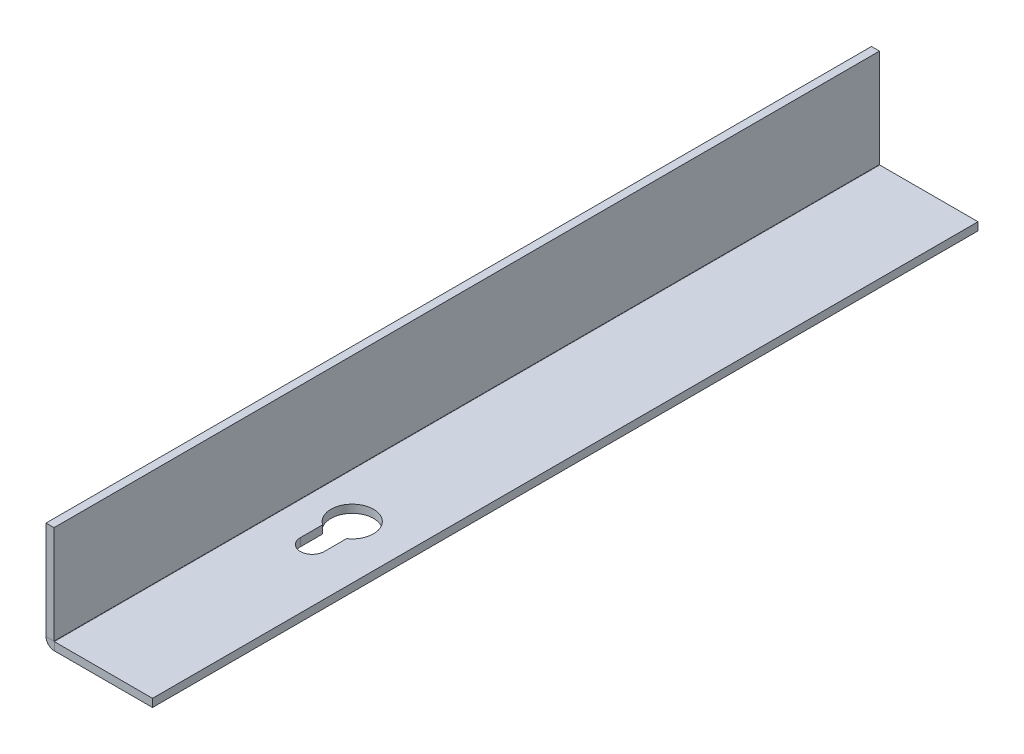
ISO-10303-21;
HEADER;
FILE_DESCRIPTION(('STEP AP214'),'2;1');
FILE_NAME('part.step','',(''),(''),'','','');
FILE_SCHEMA(('AUTOMOTIVE_DESIGN { 1 0 10303 214 1 1 1 1 }'));
ENDSEC;
DATA;
#1=APPLICATION_CONTEXT('core data for automotive mechanical design processes');
#2=APPLICATION_PROTOCOL_DEFINITION('international standard','automotive_design',2000,#1);
#3=PRODUCT_CONTEXT('',#1,'mechanical');
#4=PRODUCT('Part','Part','',(#3));
#5=PRODUCT_RELATED_PRODUCT_CATEGORY('part','',(#4));
#6=PRODUCT_DEFINITION_FORMATION('','',#4);
#7=PRODUCT_DEFINITION_CONTEXT('part definition',#1,'design');
#8=PRODUCT_DEFINITION('design','',#6,#7);
#9=PRODUCT_DEFINITION_SHAPE('','',#8);
#10=(LENGTH_UNIT() NAMED_UNIT(*) SI_UNIT(.MILLI.,.METRE.));
#11=(NAMED_UNIT(*) PLANE_ANGLE_UNIT() SI_UNIT($,.RADIAN.));
#12=(NAMED_UNIT(*) SI_UNIT($,.STERADIAN.) SOLID_ANGLE_UNIT());
#13=UNCERTAINTY_MEASURE_WITH_UNIT(LENGTH_MEASURE(1.E-05),#10,'distance_accuracy_value','');
#14=(GEOMETRIC_REPRESENTATION_CONTEXT(3) GLOBAL_UNCERTAINTY_ASSIGNED_CONTEXT((#13)) GLOBAL_UNIT_ASSIGNED_CONTEXT((#10,
#11,#12)) REPRESENTATION_CONTEXT('',''));
#15=CARTESIAN_POINT('',(0.,0.,0.));
#16=DIRECTION('',(0.,0.,1.));
#17=DIRECTION('',(1.,0.,0.));
#18=AXIS2_PLACEMENT_3D('',#15,#16,#17);
#19=CARTESIAN_POINT('',(-259.500000000001,-155.,-100.));
#20=DIRECTION('',(-1.,0.,0.));
#21=DIRECTION('',(0.,0.,1.));
#22=AXIS2_PLACEMENT_3D('',#19,#20,#21);
#23=PLANE('',#22);
#24=DIRECTION('',(0.,0.,1.));
#25=VECTOR('',#24,1.);
#26=CARTESIAN_POINT('',(-259.500000000001,-175.,20.));
#27=LINE('',#26,#25);
#28=CARTESIAN_POINT('',(-259.500000000001,-175.,-100.));
#29=VERTEX_POINT('',#28);
#30=CARTESIAN_POINT('',(-259.500000000001,-175.,-108.385621722338));
#31=VERTEX_POINT('',#30);
#32=EDGE_CURVE('E292',#29,#31,#27,.F.);
#33=ORIENTED_EDGE('',*,*,#32,.T.);
#34=DIRECTION('',(0.,1.,0.));
#35=VECTOR('',#34,1.);
#36=CARTESIAN_POINT('',(-259.500000000001,-155.,-108.385621722338));
#37=LINE('',#36,#35);
#38=CARTESIAN_POINT('',(-259.500000000001,-172.,-108.385621722338));
#39=VERTEX_POINT('',#38);
#40=EDGE_CURVE('E255',#39,#31,#37,.F.);
#41=ORIENTED_EDGE('',*,*,#40,.F.);
#42=DIRECTION('',(0.,0.,-1.));
#43=VECTOR('',#42,1.);
#44=CARTESIAN_POINT('',(-259.5,-172.,-330.));
#45=LINE('',#44,#43);
#46=CARTESIAN_POINT('',(-259.500000000001,-172.,-100.));
#47=VERTEX_POINT('',#46);
#48=EDGE_CURVE('E294',#39,#47,#45,.F.);
#49=ORIENTED_EDGE('',*,*,#48,.T.);
#50=DIRECTION('',(0.,1.,0.));
#51=VECTOR('',#50,1.);
#52=CARTESIAN_POINT('',(-259.500000000001,-155.,-100.));
#53=LINE('',#52,#51);
#54=EDGE_CURVE('E236',#29,#47,#53,.T.);
#55=ORIENTED_EDGE('',*,*,#54,.F.);
#56=EDGE_LOOP('',(#33,#41,#49,#55));
#57=FACE_BOUND('',#56,.T.);
#58=ADVANCED_FACE('F51',(#57),#23,.F.);
#59=CARTESIAN_POINT('',(-255.000000000001,-155.,-115.));
#60=DIRECTION('',(0.,-1.,0.));
#61=DIRECTION('',(0.,0.,-1.));
#62=AXIS2_PLACEMENT_3D('',#59,#60,#61);
#63=CYLINDRICAL_SURFACE('',#62,7.99999999999999);
#64=DIRECTION('',(0.,1.,0.));
#65=VECTOR('',#64,1.);
#66=CARTESIAN_POINT('',(-250.500000000001,-155.,-108.385621722338));
#67=LINE('',#66,#65);
#68=CARTESIAN_POINT('',(-250.500000000001,-175.,-108.385621722338));
#69=VERTEX_POINT('',#68);
#70=CARTESIAN_POINT('',(-250.500000000001,-172.,-108.385621722338));
#71=VERTEX_POINT('',#70);
#72=EDGE_CURVE('E299',#69,#71,#67,.T.);
#73=ORIENTED_EDGE('',*,*,#72,.T.);
#74=CARTESIAN_POINT('',(-255.000000000001,-172.,-115.));
#75=DIRECTION('',(0.,-1.,0.));
#76=DIRECTION('',(0.,0.,-1.));
#77=AXIS2_PLACEMENT_3D('',#74,#75,#76);
#78=CIRCLE('',#77,7.99999999999999);
#79=EDGE_CURVE('E75',#71,#39,#78,.F.);
#80=ORIENTED_EDGE('',*,*,#79,.T.);
#81=ORIENTED_EDGE('',*,*,#40,.T.);
#82=CARTESIAN_POINT('',(-255.000000000001,-175.,-115.));
#83=DIRECTION('',(0.,-1.,0.));
#84=DIRECTION('',(0.,0.,-1.));
#85=AXIS2_PLACEMENT_3D('',#82,#83,#84);
#86=CIRCLE('',#85,7.99999999999999);
#87=EDGE_CURVE('E250',#31,#69,#86,.T.);
#88=ORIENTED_EDGE('',*,*,#87,.T.);
#89=EDGE_LOOP('',(#73,#80,#81,#88));
#90=FACE_BOUND('',#89,.T.);
#91=ADVANCED_FACE('F307',(#90),#63,.F.);
#92=CARTESIAN_POINT('',(-250.500000000001,-155.,-100.));
#93=DIRECTION('',(1.,0.,0.));
#94=DIRECTION('',(0.,0.,-1.));
#95=AXIS2_PLACEMENT_3D('',#92,#93,#94);
#96=PLANE('',#95);
#97=DIRECTION('',(0.,0.,1.));
#98=VECTOR('',#97,1.);
#99=CARTESIAN_POINT('',(-250.500000000001,-175.,20.0000000000001));
#100=LINE('',#99,#98);
#101=CARTESIAN_POINT('',(-250.500000000001,-175.,-99.9999999999999));
#102=VERTEX_POINT('',#101);
#103=EDGE_CURVE('E245',#69,#102,#100,.T.);
#104=ORIENTED_EDGE('',*,*,#103,.T.);
#105=DIRECTION('',(0.,-1.,0.));
#106=VECTOR('',#105,1.);
#107=CARTESIAN_POINT('',(-250.500000000001,-155.,-100.));
#108=LINE('',#107,#106);
#109=CARTESIAN_POINT('',(-250.500000000001,-172.,-99.9999999999999));
#110=VERTEX_POINT('',#109);
#111=EDGE_CURVE('E242',#102,#110,#108,.F.);
#112=ORIENTED_EDGE('',*,*,#111,.T.);
#113=DIRECTION('',(0.,0.,-1.));
#114=VECTOR('',#113,1.);
#115=CARTESIAN_POINT('',(-250.5,-172.,-330.));
#116=LINE('',#115,#114);
#117=EDGE_CURVE('E237',#110,#71,#116,.T.);
#118=ORIENTED_EDGE('',*,*,#117,.T.);
#119=ORIENTED_EDGE('',*,*,#72,.F.);
#120=EDGE_LOOP('',(#104,#112,#118,#119));
#121=FACE_BOUND('',#120,.T.);
#122=ADVANCED_FACE('F310',(#121),#96,.F.);
#123=CARTESIAN_POINT('',(-255.000000000001,-155.,-99.9999999999999));
#124=DIRECTION('',(0.,-1.,0.));
#125=DIRECTION('',(0.,0.,-1.));
#126=AXIS2_PLACEMENT_3D('',#123,#124,#125);
#127=CYLINDRICAL_SURFACE('',#126,4.49999999999992);
#128=CARTESIAN_POINT('',(-255.000000000001,-175.,-99.9999999999999));
#129=DIRECTION('',(0.,-1.,0.));
#130=DIRECTION('',(0.,0.,-1.));
#131=AXIS2_PLACEMENT_3D('',#128,#129,#130);
#132=CIRCLE('',#131,4.49999999999992);
#133=EDGE_CURVE('E120',#102,#29,#132,.T.);
#134=ORIENTED_EDGE('',*,*,#133,.T.);
#135=ORIENTED_EDGE('',*,*,#54,.T.);
#136=CARTESIAN_POINT('',(-255.000000000001,-172.,-99.9999999999999));
#137=DIRECTION('',(0.,-1.,0.));
#138=DIRECTION('',(0.,0.,-1.));
#139=AXIS2_PLACEMENT_3D('',#136,#137,#138);
#140=CIRCLE('',#139,4.49999999999992);
#141=EDGE_CURVE('E118',#47,#110,#140,.F.);
#142=ORIENTED_EDGE('',*,*,#141,.T.);
#143=ORIENTED_EDGE('',*,*,#111,.F.);
#144=EDGE_LOOP('',(#134,#135,#142,#143));
#145=FACE_BOUND('',#144,.T.);
#146=ADVANCED_FACE('F286',(#145),#127,.F.);
#147=CARTESIAN_POINT('',(-235.,449.376841338627,-330.));
#148=DIRECTION('',(-1.,0.,0.));
#149=DIRECTION('',(0.,-1.,0.));
#150=AXIS2_PLACEMENT_3D('',#147,#148,#149);
#151=PLANE('',#150);
#152=DIRECTION('',(0.,-1.,0.));
#153=VECTOR('',#152,1.);
#154=CARTESIAN_POINT('',(-235.000000000001,449.376841338627,-20.0000000000001));
#155=LINE('',#154,#153);
#156=CARTESIAN_POINT('',(-235.000000000001,-172.,-19.9999999999999));
#157=VERTEX_POINT('',#156);
#158=CARTESIAN_POINT('',(-235.000000000001,-175.,-19.9999999999999));
#159=VERTEX_POINT('',#158);
#160=EDGE_CURVE('E280',#157,#159,#155,.T.);
#161=ORIENTED_EDGE('',*,*,#160,.T.);
#162=DIRECTION('',(0.,0.,1.));
#163=VECTOR('',#162,1.);
#164=CARTESIAN_POINT('',(-235.000000000001,-175.,20.0000000000001));
#165=LINE('',#164,#163);
#166=CARTESIAN_POINT('',(-235.,-175.,-330.));
#167=VERTEX_POINT('',#166);
#168=EDGE_CURVE('E209',#159,#167,#165,.F.);
#169=ORIENTED_EDGE('',*,*,#168,.T.);
#170=DIRECTION('',(0.,-1.,0.));
#171=VECTOR('',#170,1.);
#172=CARTESIAN_POINT('',(-235.,449.376841338627,-330.));
#173=LINE('',#172,#171);
#174=CARTESIAN_POINT('',(-235.,-172.,-330.));
#175=VERTEX_POINT('',#174);
#176=EDGE_CURVE('E263',#175,#167,#173,.T.);
#177=ORIENTED_EDGE('',*,*,#176,.F.);
#178=DIRECTION('',(0.,0.,1.));
#179=VECTOR('',#178,1.);
#180=CARTESIAN_POINT('',(-235.,-172.,-330.));
#181=LINE('',#180,#179);
#182=EDGE_CURVE('E12',#157,#175,#181,.F.);
#183=ORIENTED_EDGE('',*,*,#182,.F.);
#184=EDGE_LOOP('',(#161,#169,#177,#183));
#185=FACE_BOUND('',#184,.T.);
#186=ADVANCED_FACE('F279',(#185),#151,.F.);
#187=CARTESIAN_POINT('',(-6.66133814775094E-13,449.376841338627,-19.9999999999996));
#188=DIRECTION('',(0.,0.,-1.));
#189=DIRECTION('',(0.,-1.,0.));
#190=AXIS2_PLACEMENT_3D('',#187,#188,#189);
#191=PLANE('',#190);
#192=DIRECTION('',(0.,-1.,0.));
#193=VECTOR('',#192,1.);
#194=CARTESIAN_POINT('',(-271.9,449.376841338627,-20.0000000000002));
#195=LINE('',#194,#193);
#196=CARTESIAN_POINT('',(-271.900000000001,-172.,-19.9999999999999));
#197=VERTEX_POINT('',#196);
#198=CARTESIAN_POINT('',(-271.900000000012,-174.999999999999,-19.9999999999999));
#199=VERTEX_POINT('',#198);
#200=EDGE_CURVE('E196',#197,#199,#195,.T.);
#201=ORIENTED_EDGE('',*,*,#200,.T.);
#202=DIRECTION('',(-1.,0.,0.));
#203=VECTOR('',#202,1.);
#204=CARTESIAN_POINT('',(-275.000000000001,-175.,-20.));
#205=LINE('',#204,#203);
#206=EDGE_CURVE('E191',#159,#199,#205,.T.);
#207=ORIENTED_EDGE('',*,*,#206,.F.);
#208=ORIENTED_EDGE('',*,*,#160,.F.);
#209=DIRECTION('',(1.,0.,0.));
#210=VECTOR('',#209,1.);
#211=CARTESIAN_POINT('',(-6.66133814775094E-13,-172.,-19.9999999999994));
#212=LINE('',#211,#210);
#213=EDGE_CURVE('E63',#197,#157,#212,.T.);
#214=ORIENTED_EDGE('',*,*,#213,.F.);
#215=EDGE_LOOP('',(#201,#207,#208,#214));
#216=FACE_BOUND('',#215,.T.);
#217=ADVANCED_FACE('F205',(#216),#191,.F.);
#218=CARTESIAN_POINT('',(-275.000000000001,-175.,20.));
#219=DIRECTION('',(0.,1.,0.));
#220=DIRECTION('',(0.,0.,1.));
#221=AXIS2_PLACEMENT_3D('',#218,#219,#220);
#222=PLANE('',#221);
#223=ORIENTED_EDGE('',*,*,#206,.T.);
#224=DIRECTION('',(0.,0.,-1.));
#225=VECTOR('',#224,1.);
#226=CARTESIAN_POINT('',(-271.9,-175.,-20.));
#227=LINE('',#226,#225);
#228=CARTESIAN_POINT('',(-271.9,-174.999999999999,-330.));
#229=VERTEX_POINT('',#228);
#230=EDGE_CURVE('E177',#199,#229,#227,.T.);
#231=ORIENTED_EDGE('',*,*,#230,.T.);
#232=DIRECTION('',(1.,0.,0.));
#233=VECTOR('',#232,1.);
#234=CARTESIAN_POINT('',(-275.,-175.,-330.));
#235=LINE('',#234,#233);
#236=EDGE_CURVE('E190',#167,#229,#235,.F.);
#237=ORIENTED_EDGE('',*,*,#236,.F.);
#238=ORIENTED_EDGE('',*,*,#168,.F.);
#239=EDGE_LOOP('',(#223,#231,#237,#238));
#240=FACE_BOUND('',#239,.T.);
#241=ORIENTED_EDGE('',*,*,#133,.F.);
#242=ORIENTED_EDGE('',*,*,#103,.F.);
#243=ORIENTED_EDGE('',*,*,#87,.F.);
#244=ORIENTED_EDGE('',*,*,#32,.F.);
#245=EDGE_LOOP('',(#241,#242,#243,#244));
#246=FACE_BOUND('',#245,.T.);
#247=ADVANCED_FACE('F212',(#240,#246),#222,.F.);
#248=CARTESIAN_POINT('',(-272.,449.376841338627,-330.));
#249=DIRECTION('',(0.,0.,-1.));
#250=DIRECTION('',(0.,-1.,0.));
#251=AXIS2_PLACEMENT_3D('',#248,#249,#250);
#252=PLANE('',#251);
#253=ORIENTED_EDGE('',*,*,#236,.T.);
#254=DIRECTION('',(0.,-1.,0.));
#255=VECTOR('',#254,1.);
#256=CARTESIAN_POINT('',(-271.9,449.376841338627,-330.));
#257=LINE('',#256,#255);
#258=CARTESIAN_POINT('',(-271.9,-172.,-330.));
#259=VERTEX_POINT('',#258);
#260=EDGE_CURVE('E274',#259,#229,#257,.T.);
#261=ORIENTED_EDGE('',*,*,#260,.F.);
#262=DIRECTION('',(1.,0.,0.));
#263=VECTOR('',#262,1.);
#264=CARTESIAN_POINT('',(-272.,-172.,-330.));
#265=LINE('',#264,#263);
#266=EDGE_CURVE('E266',#259,#175,#265,.T.);
#267=ORIENTED_EDGE('',*,*,#266,.T.);
#268=ORIENTED_EDGE('',*,*,#176,.T.);
#269=EDGE_LOOP('',(#253,#261,#267,#268));
#270=FACE_BOUND('',#269,.T.);
#271=ADVANCED_FACE('F273',(#270),#252,.T.);
#272=CARTESIAN_POINT('',(-272.000000000001,-172.,20.01));
#273=DIRECTION('',(0.,1.,0.));
#274=DIRECTION('',(0.,0.,1.));
#275=AXIS2_PLACEMENT_3D('',#272,#273,#274);
#276=PLANE('',#275);
#277=DIRECTION('',(0.,0.,-1.));
#278=VECTOR('',#277,1.);
#279=CARTESIAN_POINT('',(-271.9,-172.,-20.));
#280=LINE('',#279,#278);
#281=EDGE_CURVE('E55',#197,#259,#280,.T.);
#282=ORIENTED_EDGE('',*,*,#281,.F.);
#283=ORIENTED_EDGE('',*,*,#213,.T.);
#284=ORIENTED_EDGE('',*,*,#182,.T.);
#285=ORIENTED_EDGE('',*,*,#266,.F.);
#286=EDGE_LOOP('',(#282,#283,#284,#285));
#287=FACE_BOUND('',#286,.T.);
#288=ORIENTED_EDGE('',*,*,#141,.F.);
#289=ORIENTED_EDGE('',*,*,#48,.F.);
#290=ORIENTED_EDGE('',*,*,#79,.F.);
#291=ORIENTED_EDGE('',*,*,#117,.F.);
#292=EDGE_LOOP('',(#288,#289,#290,#291));
#293=FACE_BOUND('',#292,.T.);
#294=ADVANCED_FACE('F53',(#287,#293),#276,.T.);
#295=CARTESIAN_POINT('',(349.376841338627,1.87303106931304E-12,-20.));
#296=DIRECTION('',(0.,0.,-1.));
#297=DIRECTION('',(-1.,0.,0.));
#298=AXIS2_PLACEMENT_3D('',#295,#296,#297);
#299=PLANE('',#298);
#300=DIRECTION('',(-1.,0.,0.));
#301=VECTOR('',#300,1.);
#302=CARTESIAN_POINT('',(349.376841338627,-134.999999999998,-20.));
#303=LINE('',#302,#301);
#304=CARTESIAN_POINT('',(-272.,-135.,-20.));
#305=VERTEX_POINT('',#304);
#306=CARTESIAN_POINT('',(-275.,-135.,-20.));
#307=VERTEX_POINT('',#306);
#308=EDGE_CURVE('E531',#305,#307,#303,.T.);
#309=ORIENTED_EDGE('',*,*,#308,.T.);
#310=DIRECTION('',(0.,1.,0.));
#311=VECTOR('',#310,1.);
#312=CARTESIAN_POINT('',(-275.,175.,-20.));
#313=LINE('',#312,#311);
#314=CARTESIAN_POINT('',(-274.999999999999,-171.9,-19.9999999999999));
#315=VERTEX_POINT('',#314);
#316=EDGE_CURVE('E547',#315,#307,#313,.T.);
#317=ORIENTED_EDGE('',*,*,#316,.F.);
#318=DIRECTION('',(-1.,0.,0.));
#319=VECTOR('',#318,1.);
#320=CARTESIAN_POINT('',(349.376841338627,-171.899999999998,-20.));
#321=LINE('',#320,#319);
#322=CARTESIAN_POINT('',(-272.,-171.9,-19.9999999999999));
#323=VERTEX_POINT('',#322);
#324=EDGE_CURVE('E199',#323,#315,#321,.T.);
#325=ORIENTED_EDGE('',*,*,#324,.F.);
#326=DIRECTION('',(0.,1.,0.));
#327=VECTOR('',#326,1.);
#328=CARTESIAN_POINT('',(-272.,0.,-20.));
#329=LINE('',#328,#327);
#330=EDGE_CURVE('E576',#305,#323,#329,.F.);
#331=ORIENTED_EDGE('',*,*,#330,.F.);
#332=EDGE_LOOP('',(#309,#317,#325,#331));
#333=FACE_BOUND('',#332,.T.);
#334=ADVANCED_FACE('F312',(#333),#299,.F.);
#335=CARTESIAN_POINT('',(349.376841338627,-134.999999999998,-330.));
#336=DIRECTION('',(0.,0.,-1.));
#337=DIRECTION('',(-1.,0.,0.));
#338=AXIS2_PLACEMENT_3D('',#335,#336,#337);
#339=PLANE('',#338);
#340=DIRECTION('',(0.,1.,0.));
#341=VECTOR('',#340,1.);
#342=CARTESIAN_POINT('',(-275.,175.,-330.));
#343=LINE('',#342,#341);
#344=CARTESIAN_POINT('',(-274.999999999999,-171.900000000012,-330.));
#345=VERTEX_POINT('',#344);
#346=CARTESIAN_POINT('',(-275.,-135.,-330.));
#347=VERTEX_POINT('',#346);
#348=EDGE_CURVE('E555',#345,#347,#343,.T.);
#349=ORIENTED_EDGE('',*,*,#348,.T.);
#350=DIRECTION('',(-1.,0.,0.));
#351=VECTOR('',#350,1.);
#352=CARTESIAN_POINT('',(349.376841338627,-134.999999999998,-330.));
#353=LINE('',#352,#351);
#354=CARTESIAN_POINT('',(-272.,-135.,-330.));
#355=VERTEX_POINT('',#354);
#356=EDGE_CURVE('E527',#355,#347,#353,.T.);
#357=ORIENTED_EDGE('',*,*,#356,.F.);
#358=DIRECTION('',(0.,-1.,0.));
#359=VECTOR('',#358,1.);
#360=CARTESIAN_POINT('',(-272.,-135.,-330.));
#361=LINE('',#360,#359);
#362=CARTESIAN_POINT('',(-272.,-171.900000000002,-330.));
#363=VERTEX_POINT('',#362);
#364=EDGE_CURVE('E140',#355,#363,#361,.T.);
#365=ORIENTED_EDGE('',*,*,#364,.T.);
#366=DIRECTION('',(-1.,0.,0.));
#367=VECTOR('',#366,1.);
#368=CARTESIAN_POINT('',(349.376841338627,-171.899999999998,-330.));
#369=LINE('',#368,#367);
#370=EDGE_CURVE('E524',#363,#345,#369,.T.);
#371=ORIENTED_EDGE('',*,*,#370,.T.);
#372=EDGE_LOOP('',(#349,#357,#365,#371));
#373=FACE_BOUND('',#372,.T.);
#374=ADVANCED_FACE('F318',(#373),#339,.T.);
#375=CARTESIAN_POINT('',(349.376841338627,-134.999999999998,20.01));
#376=DIRECTION('',(0.,1.,0.));
#377=DIRECTION('',(-1.,0.,0.));
#378=AXIS2_PLACEMENT_3D('',#375,#376,#377);
#379=PLANE('',#378);
#380=DIRECTION('',(0.,0.,1.));
#381=VECTOR('',#380,1.);
#382=CARTESIAN_POINT('',(-275.,-135.,20.));
#383=LINE('',#382,#381);
#384=EDGE_CURVE('E131',#347,#307,#383,.T.);
#385=ORIENTED_EDGE('',*,*,#384,.T.);
#386=ORIENTED_EDGE('',*,*,#308,.F.);
#387=DIRECTION('',(0.,0.,-1.));
#388=VECTOR('',#387,1.);
#389=CARTESIAN_POINT('',(-272.,-135.,20.01));
#390=LINE('',#389,#388);
#391=EDGE_CURVE('E563',#305,#355,#390,.T.);
#392=ORIENTED_EDGE('',*,*,#391,.T.);
#393=ORIENTED_EDGE('',*,*,#356,.T.);
#394=EDGE_LOOP('',(#385,#386,#392,#393));
#395=FACE_BOUND('',#394,.T.);
#396=ADVANCED_FACE('F374',(#395),#379,.T.);
#397=CARTESIAN_POINT('',(-272.,-135.,20.01));
#398=DIRECTION('',(1.,0.,0.));
#399=DIRECTION('',(0.,1.,0.));
#400=AXIS2_PLACEMENT_3D('',#397,#398,#399);
#401=PLANE('',#400);
#402=ORIENTED_EDGE('',*,*,#330,.T.);
#403=DIRECTION('',(0.,0.,-1.));
#404=VECTOR('',#403,1.);
#405=CARTESIAN_POINT('',(-272.,-171.9,-20.));
#406=LINE('',#405,#404);
#407=EDGE_CURVE('E518',#323,#363,#406,.T.);
#408=ORIENTED_EDGE('',*,*,#407,.T.);
#409=ORIENTED_EDGE('',*,*,#364,.F.);
#410=ORIENTED_EDGE('',*,*,#391,.F.);
#411=EDGE_LOOP('',(#402,#408,#409,#410));
#412=FACE_BOUND('',#411,.T.);
#413=ADVANCED_FACE('F383',(#412),#401,.T.);
#414=CARTESIAN_POINT('',(-275.,175.,20.));
#415=DIRECTION('',(1.,0.,0.));
#416=DIRECTION('',(0.,1.,0.));
#417=AXIS2_PLACEMENT_3D('',#414,#415,#416);
#418=PLANE('',#417);
#419=DIRECTION('',(0.,0.,-1.));
#420=VECTOR('',#419,1.);
#421=CARTESIAN_POINT('',(-275.,-171.9,-20.));
#422=LINE('',#421,#420);
#423=EDGE_CURVE('E560',#315,#345,#422,.T.);
#424=ORIENTED_EDGE('',*,*,#423,.F.);
#425=ORIENTED_EDGE('',*,*,#316,.T.);
#426=ORIENTED_EDGE('',*,*,#384,.F.);
#427=ORIENTED_EDGE('',*,*,#348,.F.);
#428=EDGE_LOOP('',(#424,#425,#426,#427));
#429=FACE_BOUND('',#428,.T.);
#430=ADVANCED_FACE('F392',(#429),#418,.F.);
#431=CARTESIAN_POINT('',(-271.9,-171.9,-330.));
#432=DIRECTION('',(0.,0.,-1.));
#433=DIRECTION('',(-1.,0.,0.));
#434=AXIS2_PLACEMENT_3D('',#431,#432,#433);
#435=PLANE('',#434);
#436=ORIENTED_EDGE('',*,*,#370,.F.);
#437=CARTESIAN_POINT('',(-271.9,-171.9,-330.));
#438=DIRECTION('',(0.,0.,-1.));
#439=DIRECTION('',(-1.,0.,0.));
#440=AXIS2_PLACEMENT_3D('',#437,#438,#439);
#441=CIRCLE('',#440,0.0999999999999849);
#442=EDGE_CURVE('E201',#363,#259,#441,.F.);
#443=ORIENTED_EDGE('',*,*,#442,.T.);
#444=ORIENTED_EDGE('',*,*,#260,.T.);
#445=CARTESIAN_POINT('',(-271.9,-171.9,-330.));
#446=DIRECTION('',(0.,0.,-1.));
#447=DIRECTION('',(-1.,0.,0.));
#448=AXIS2_PLACEMENT_3D('',#445,#446,#447);
#449=CIRCLE('',#448,3.09999999999911);
#450=EDGE_CURVE('E183',#345,#229,#449,.F.);
#451=ORIENTED_EDGE('',*,*,#450,.F.);
#452=EDGE_LOOP('',(#436,#443,#444,#451));
#453=FACE_BOUND('',#452,.T.);
#454=ADVANCED_FACE('F401',(#453),#435,.T.);
#455=CARTESIAN_POINT('',(-271.9,-171.9,-20.));
#456=DIRECTION('',(0.,0.,1.));
#457=DIRECTION('',(1.,0.,0.));
#458=AXIS2_PLACEMENT_3D('',#455,#456,#457);
#459=PLANE('',#458);
#460=ORIENTED_EDGE('',*,*,#200,.F.);
#461=CARTESIAN_POINT('',(-271.9,-171.9,-19.9999999999999));
#462=DIRECTION('',(0.,0.,-1.));
#463=DIRECTION('',(-1.,0.,0.));
#464=AXIS2_PLACEMENT_3D('',#461,#462,#463);
#465=CIRCLE('',#464,0.0999999999999849);
#466=EDGE_CURVE('E516',#197,#323,#465,.T.);
#467=ORIENTED_EDGE('',*,*,#466,.T.);
#468=ORIENTED_EDGE('',*,*,#324,.T.);
#469=CARTESIAN_POINT('',(-271.9,-171.9,-19.9999999999999));
#470=DIRECTION('',(0.,0.,-1.));
#471=DIRECTION('',(-1.,0.,0.));
#472=AXIS2_PLACEMENT_3D('',#469,#470,#471);
#473=CIRCLE('',#472,3.09999999999911);
#474=EDGE_CURVE('E181',#199,#315,#473,.T.);
#475=ORIENTED_EDGE('',*,*,#474,.F.);
#476=EDGE_LOOP('',(#460,#467,#468,#475));
#477=FACE_BOUND('',#476,.T.);
#478=ADVANCED_FACE('F195',(#477),#459,.T.);
#479=CARTESIAN_POINT('',(-271.900000000001,-171.900000000001,298.86385809621));
#480=DIRECTION('',(0.,0.,-1.));
#481=DIRECTION('',(-1.,0.,0.));
#482=AXIS2_PLACEMENT_3D('',#479,#480,#481);
#483=CYLINDRICAL_SURFACE('',#482,3.09999999999911);
#484=ORIENTED_EDGE('',*,*,#474,.T.);
#485=ORIENTED_EDGE('',*,*,#423,.T.);
#486=ORIENTED_EDGE('',*,*,#450,.T.);
#487=ORIENTED_EDGE('',*,*,#230,.F.);
#488=EDGE_LOOP('',(#484,#485,#486,#487));
#489=FACE_BOUND('',#488,.T.);
#490=ADVANCED_FACE('F179',(#489),#483,.T.);
#491=CARTESIAN_POINT('',(-271.900000000001,-171.900000000001,298.86385809621));
#492=DIRECTION('',(0.,0.,-1.));
#493=DIRECTION('',(-1.,0.,0.));
#494=AXIS2_PLACEMENT_3D('',#491,#492,#493);
#495=CYLINDRICAL_SURFACE('',#494,0.0999999999999849);
#496=ORIENTED_EDGE('',*,*,#466,.F.);
#497=ORIENTED_EDGE('',*,*,#281,.T.);
#498=ORIENTED_EDGE('',*,*,#442,.F.);
#499=ORIENTED_EDGE('',*,*,#407,.F.);
#500=EDGE_LOOP('',(#496,#497,#498,#499));
#501=FACE_BOUND('',#500,.T.);
#502=ADVANCED_FACE('F426',(#501),#495,.F.);
#503=CLOSED_SHELL('',(#58,#91,#122,#146,#186,#217,#247,#271,#294,#334,#374,#396,#413,#430,#454,
#478,#490,#502));
#504=MANIFOLD_SOLID_BREP('B2',#503);
#505=ADVANCED_BREP_SHAPE_REPRESENTATION('',(#18,#504),#14);
#506=SHAPE_DEFINITION_REPRESENTATION(#9,#505);
ENDSEC;
END-ISO-10303-21;
